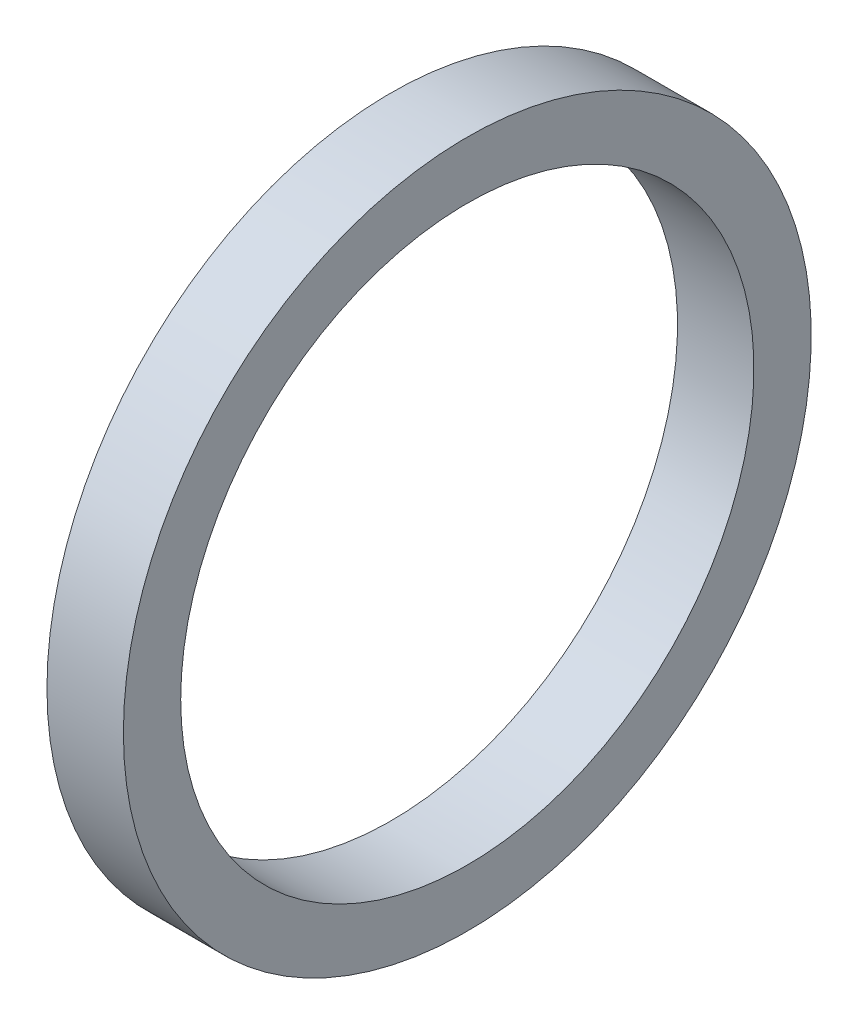
ISO-10303-21;
HEADER;
FILE_DESCRIPTION(('STEP AP214'),'2;1');
FILE_NAME('part.step','',(''),(''),'','','');
FILE_SCHEMA(('AUTOMOTIVE_DESIGN { 1 0 10303 214 1 1 1 1 }'));
ENDSEC;
DATA;
#1=APPLICATION_CONTEXT('core data for automotive mechanical design processes');
#2=APPLICATION_PROTOCOL_DEFINITION('international standard','automotive_design',2000,#1);
#3=PRODUCT_CONTEXT('',#1,'mechanical');
#4=PRODUCT('Part','Part','',(#3));
#5=PRODUCT_RELATED_PRODUCT_CATEGORY('part','',(#4));
#6=PRODUCT_DEFINITION_FORMATION('','',#4);
#7=PRODUCT_DEFINITION_CONTEXT('part definition',#1,'design');
#8=PRODUCT_DEFINITION('design','',#6,#7);
#9=PRODUCT_DEFINITION_SHAPE('','',#8);
#10=(LENGTH_UNIT() NAMED_UNIT(*) SI_UNIT(.MILLI.,.METRE.));
#11=(NAMED_UNIT(*) PLANE_ANGLE_UNIT() SI_UNIT($,.RADIAN.));
#12=(NAMED_UNIT(*) SI_UNIT($,.STERADIAN.) SOLID_ANGLE_UNIT());
#13=UNCERTAINTY_MEASURE_WITH_UNIT(LENGTH_MEASURE(1.E-05),#10,'distance_accuracy_value','');
#14=(GEOMETRIC_REPRESENTATION_CONTEXT(3) GLOBAL_UNCERTAINTY_ASSIGNED_CONTEXT((#13)) GLOBAL_UNIT_ASSIGNED_CONTEXT((#10,
#11,#12)) REPRESENTATION_CONTEXT('',''));
#15=CARTESIAN_POINT('',(0.,0.,0.));
#16=DIRECTION('',(0.,0.,1.));
#17=DIRECTION('',(1.,0.,0.));
#18=AXIS2_PLACEMENT_3D('',#15,#16,#17);
#19=CARTESIAN_POINT('',(0.,0.,-7.75));
#20=DIRECTION('',(1.,0.,0.));
#21=DIRECTION('',(0.,0.,-1.));
#22=AXIS2_PLACEMENT_3D('',#19,#20,#21);
#23=PLANE('',#22);
#24=CARTESIAN_POINT('',(0.,0.,0.));
#25=DIRECTION('',(-1.,0.,0.));
#26=DIRECTION('',(0.,0.,1.));
#27=AXIS2_PLACEMENT_3D('',#24,#25,#26);
#28=CIRCLE('',#27,7.5);
#29=CARTESIAN_POINT('',(0.,0.,7.5));
#30=VERTEX_POINT('',#29);
#31=EDGE_CURVE('E60',#30,#30,#28,.T.);
#32=ORIENTED_EDGE('',*,*,#31,.F.);
#33=EDGE_LOOP('',(#32));
#34=FACE_BOUND('',#33,.T.);
#35=CARTESIAN_POINT('',(0.,0.,0.));
#36=DIRECTION('',(-1.,0.,0.));
#37=DIRECTION('',(0.,0.,1.));
#38=AXIS2_PLACEMENT_3D('',#35,#36,#37);
#39=CIRCLE('',#38,7.75);
#40=CARTESIAN_POINT('',(0.,0.,7.75));
#41=VERTEX_POINT('',#40);
#42=EDGE_CURVE('E10',#41,#41,#39,.T.);
#43=ORIENTED_EDGE('',*,*,#42,.T.);
#44=EDGE_LOOP('',(#43));
#45=FACE_BOUND('',#44,.T.);
#46=ADVANCED_FACE('F32',(#34,#45),#23,.F.);
#47=CARTESIAN_POINT('',(1.37545252635341,0.,0.));
#48=DIRECTION('',(1.,0.,0.));
#49=DIRECTION('',(0.,0.,-1.));
#50=AXIS2_PLACEMENT_3D('',#47,#48,#49);
#51=CONICAL_SURFACE('',#50,8.00416186652127,0.182723079700869);
#52=ORIENTED_EDGE('',*,*,#42,.F.);
#53=EDGE_LOOP('',(#52));
#54=FACE_BOUND('',#53,.T.);
#55=CARTESIAN_POINT('',(1.37545252635341,0.,0.));
#56=DIRECTION('',(-1.,0.,0.));
#57=DIRECTION('',(0.,0.,1.));
#58=AXIS2_PLACEMENT_3D('',#55,#56,#57);
#59=CIRCLE('',#58,8.00416186652127);
#60=CARTESIAN_POINT('',(1.37545252635341,0.,8.00416186652127));
#61=VERTEX_POINT('',#60);
#62=EDGE_CURVE('E38',#61,#61,#59,.T.);
#63=ORIENTED_EDGE('',*,*,#62,.T.);
#64=EDGE_LOOP('',(#63));
#65=FACE_BOUND('',#64,.T.);
#66=ADVANCED_FACE('F67',(#54,#65),#51,.T.);
#67=CARTESIAN_POINT('',(1.33002552856912,0.,0.));
#68=DIRECTION('',(-1.,0.,0.));
#69=DIRECTION('',(0.,0.,1.));
#70=AXIS2_PLACEMENT_3D('',#67,#68,#69);
#71=TOROIDAL_SURFACE('',#70,8.25,0.25);
#72=ORIENTED_EDGE('',*,*,#62,.F.);
#73=EDGE_LOOP('',(#72));
#74=FACE_BOUND('',#73,.T.);
#75=CARTESIAN_POINT('',(1.37545252635341,0.,0.));
#76=DIRECTION('',(-1.,0.,0.));
#77=DIRECTION('',(0.,0.,1.));
#78=AXIS2_PLACEMENT_3D('',#75,#76,#77);
#79=CIRCLE('',#78,8.49583813347873);
#80=CARTESIAN_POINT('',(1.37545252635341,0.,8.49583813347873));
#81=VERTEX_POINT('',#80);
#82=EDGE_CURVE('E42',#81,#81,#79,.T.);
#83=ORIENTED_EDGE('',*,*,#82,.T.);
#84=EDGE_LOOP('',(#83));
#85=FACE_BOUND('',#84,.T.);
#86=ADVANCED_FACE('F71',(#74,#85),#71,.F.);
#87=CARTESIAN_POINT('',(0.,0.,0.));
#88=DIRECTION('',(-1.,0.,0.));
#89=DIRECTION('',(0.,0.,1.));
#90=AXIS2_PLACEMENT_3D('',#87,#88,#89);
#91=CONICAL_SURFACE('',#90,8.75,0.182723079700867);
#92=ORIENTED_EDGE('',*,*,#82,.F.);
#93=EDGE_LOOP('',(#92));
#94=FACE_BOUND('',#93,.T.);
#95=CARTESIAN_POINT('',(0.,0.,0.));
#96=DIRECTION('',(-1.,0.,0.));
#97=DIRECTION('',(0.,0.,1.));
#98=AXIS2_PLACEMENT_3D('',#95,#96,#97);
#99=CIRCLE('',#98,8.75);
#100=CARTESIAN_POINT('',(0.,0.,8.75));
#101=VERTEX_POINT('',#100);
#102=EDGE_CURVE('E46',#101,#101,#99,.T.);
#103=ORIENTED_EDGE('',*,*,#102,.T.);
#104=EDGE_LOOP('',(#103));
#105=FACE_BOUND('',#104,.T.);
#106=ADVANCED_FACE('F76',(#94,#105),#91,.F.);
#107=CARTESIAN_POINT('',(0.,0.,-9.));
#108=DIRECTION('',(1.,0.,0.));
#109=DIRECTION('',(0.,0.,-1.));
#110=AXIS2_PLACEMENT_3D('',#107,#108,#109);
#111=PLANE('',#110);
#112=ORIENTED_EDGE('',*,*,#102,.F.);
#113=EDGE_LOOP('',(#112));
#114=FACE_BOUND('',#113,.T.);
#115=CARTESIAN_POINT('',(0.,0.,0.));
#116=DIRECTION('',(-1.,0.,0.));
#117=DIRECTION('',(0.,0.,1.));
#118=AXIS2_PLACEMENT_3D('',#115,#116,#117);
#119=CIRCLE('',#118,9.);
#120=CARTESIAN_POINT('',(0.,0.,9.));
#121=VERTEX_POINT('',#120);
#122=EDGE_CURVE('E51',#121,#121,#119,.T.);
#123=ORIENTED_EDGE('',*,*,#122,.T.);
#124=EDGE_LOOP('',(#123));
#125=FACE_BOUND('',#124,.T.);
#126=ADVANCED_FACE('F82',(#114,#125),#111,.F.);
#127=CARTESIAN_POINT('',(0.,0.,0.));
#128=DIRECTION('',(-1.,0.,0.));
#129=DIRECTION('',(0.,0.,1.));
#130=AXIS2_PLACEMENT_3D('',#127,#128,#129);
#131=CYLINDRICAL_SURFACE('',#130,9.);
#132=ORIENTED_EDGE('',*,*,#122,.F.);
#133=EDGE_LOOP('',(#132));
#134=FACE_BOUND('',#133,.T.);
#135=CARTESIAN_POINT('',(2.,0.,0.));
#136=DIRECTION('',(-1.,0.,0.));
#137=DIRECTION('',(0.,0.,1.));
#138=AXIS2_PLACEMENT_3D('',#135,#136,#137);
#139=CIRCLE('',#138,9.);
#140=CARTESIAN_POINT('',(2.,0.,9.));
#141=VERTEX_POINT('',#140);
#142=EDGE_CURVE('E54',#141,#141,#139,.T.);
#143=ORIENTED_EDGE('',*,*,#142,.T.);
#144=EDGE_LOOP('',(#143));
#145=FACE_BOUND('',#144,.T.);
#146=ADVANCED_FACE('F86',(#134,#145),#131,.T.);
#147=CARTESIAN_POINT('',(2.,0.,-7.5));
#148=DIRECTION('',(-1.,0.,0.));
#149=DIRECTION('',(0.,0.,1.));
#150=AXIS2_PLACEMENT_3D('',#147,#148,#149);
#151=PLANE('',#150);
#152=ORIENTED_EDGE('',*,*,#142,.F.);
#153=EDGE_LOOP('',(#152));
#154=FACE_BOUND('',#153,.T.);
#155=CARTESIAN_POINT('',(2.,0.,0.));
#156=DIRECTION('',(-1.,0.,0.));
#157=DIRECTION('',(0.,0.,1.));
#158=AXIS2_PLACEMENT_3D('',#155,#156,#157);
#159=CIRCLE('',#158,7.5);
#160=CARTESIAN_POINT('',(2.,0.,7.5));
#161=VERTEX_POINT('',#160);
#162=EDGE_CURVE('E57',#161,#161,#159,.T.);
#163=ORIENTED_EDGE('',*,*,#162,.T.);
#164=EDGE_LOOP('',(#163));
#165=FACE_BOUND('',#164,.T.);
#166=ADVANCED_FACE('F90',(#154,#165),#151,.F.);
#167=CARTESIAN_POINT('',(0.,0.,0.));
#168=DIRECTION('',(-1.,0.,0.));
#169=DIRECTION('',(0.,0.,1.));
#170=AXIS2_PLACEMENT_3D('',#167,#168,#169);
#171=CYLINDRICAL_SURFACE('',#170,7.5);
#172=ORIENTED_EDGE('',*,*,#162,.F.);
#173=EDGE_LOOP('',(#172));
#174=FACE_BOUND('',#173,.T.);
#175=ORIENTED_EDGE('',*,*,#31,.T.);
#176=EDGE_LOOP('',(#175));
#177=FACE_BOUND('',#176,.T.);
#178=ADVANCED_FACE('F64',(#174,#177),#171,.F.);
#179=CLOSED_SHELL('',(#46,#66,#86,#106,#126,#146,#166,#178));
#180=MANIFOLD_SOLID_BREP('B2',#179);
#181=ADVANCED_BREP_SHAPE_REPRESENTATION('',(#18,#180),#14);
#182=SHAPE_DEFINITION_REPRESENTATION(#9,#181);
ENDSEC;
END-ISO-10303-21;
